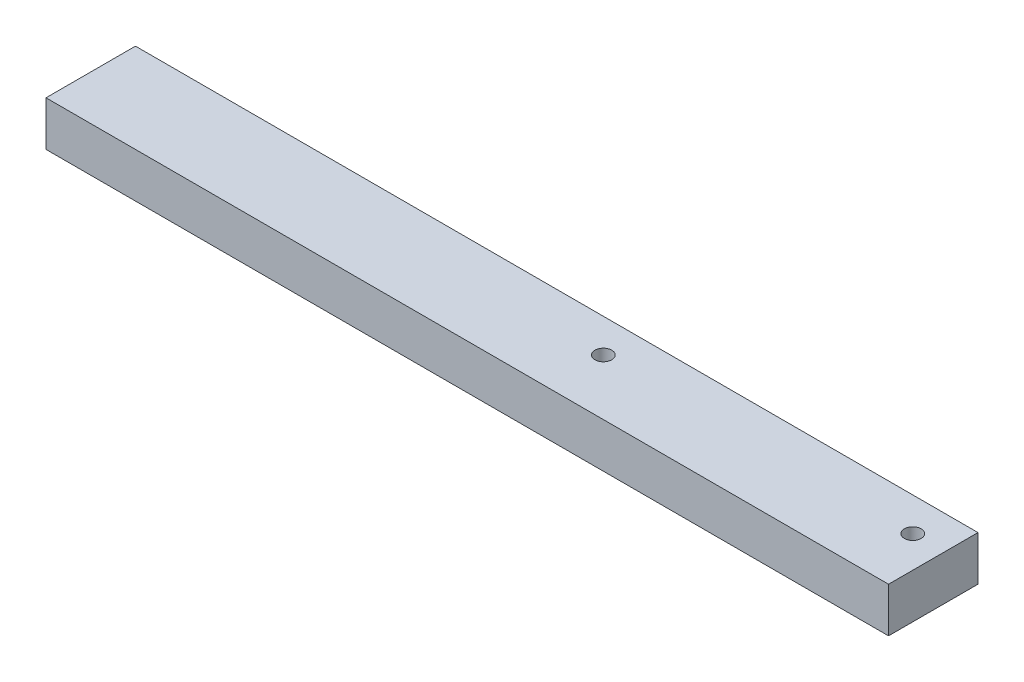
ISO-10303-21;
HEADER;
FILE_DESCRIPTION(('STEP AP214'),'2;1');
FILE_NAME('part.step','',(''),(''),'','','');
FILE_SCHEMA(('AUTOMOTIVE_DESIGN { 1 0 10303 214 1 1 1 1 }'));
ENDSEC;
DATA;
#1=APPLICATION_CONTEXT('core data for automotive mechanical design processes');
#2=APPLICATION_PROTOCOL_DEFINITION('international standard','automotive_design',2000,#1);
#3=PRODUCT_CONTEXT('',#1,'mechanical');
#4=PRODUCT('Part','Part','',(#3));
#5=PRODUCT_RELATED_PRODUCT_CATEGORY('part','',(#4));
#6=PRODUCT_DEFINITION_FORMATION('','',#4);
#7=PRODUCT_DEFINITION_CONTEXT('part definition',#1,'design');
#8=PRODUCT_DEFINITION('design','',#6,#7);
#9=PRODUCT_DEFINITION_SHAPE('','',#8);
#10=(LENGTH_UNIT() NAMED_UNIT(*) SI_UNIT(.MILLI.,.METRE.));
#11=(NAMED_UNIT(*) PLANE_ANGLE_UNIT() SI_UNIT($,.RADIAN.));
#12=(NAMED_UNIT(*) SI_UNIT($,.STERADIAN.) SOLID_ANGLE_UNIT());
#13=UNCERTAINTY_MEASURE_WITH_UNIT(LENGTH_MEASURE(1.E-05),#10,'distance_accuracy_value','');
#14=(GEOMETRIC_REPRESENTATION_CONTEXT(3) GLOBAL_UNCERTAINTY_ASSIGNED_CONTEXT((#13)) GLOBAL_UNIT_ASSIGNED_CONTEXT((#10,
#11,#12)) REPRESENTATION_CONTEXT('',''));
#15=CARTESIAN_POINT('',(0.,0.,0.));
#16=DIRECTION('',(0.,0.,1.));
#17=DIRECTION('',(1.,0.,0.));
#18=AXIS2_PLACEMENT_3D('',#15,#16,#17);
#19=CARTESIAN_POINT('',(226.,23.9999999999995,24.0000000000001));
#20=DIRECTION('',(-1.,0.,0.));
#21=DIRECTION('',(0.,0.,1.));
#22=AXIS2_PLACEMENT_3D('',#19,#20,#21);
#23=PLANE('',#22);
#24=DIRECTION('',(0.,0.,-1.));
#25=VECTOR('',#24,1.);
#26=CARTESIAN_POINT('',(226.,-5.55111512312578E-13,24.));
#27=LINE('',#26,#25);
#28=CARTESIAN_POINT('',(226.,-5.55111512312578E-13,24.));
#29=VERTEX_POINT('',#28);
#30=CARTESIAN_POINT('',(226.,7.49400541621981E-13,-24.));
#31=VERTEX_POINT('',#30);
#32=EDGE_CURVE('E114',#29,#31,#27,.T.);
#33=ORIENTED_EDGE('',*,*,#32,.T.);
#34=DIRECTION('',(0.,-1.,0.));
#35=VECTOR('',#34,1.);
#36=CARTESIAN_POINT('',(226.,24.,-24.));
#37=LINE('',#36,#35);
#38=CARTESIAN_POINT('',(226.,24.,-24.));
#39=VERTEX_POINT('',#38);
#40=EDGE_CURVE('E11',#39,#31,#37,.T.);
#41=ORIENTED_EDGE('',*,*,#40,.F.);
#42=DIRECTION('',(0.,0.,-1.));
#43=VECTOR('',#42,1.);
#44=CARTESIAN_POINT('',(226.,23.9999999999995,24.0000000000001));
#45=LINE('',#44,#43);
#46=CARTESIAN_POINT('',(226.,23.9999999999995,24.0000000000001));
#47=VERTEX_POINT('',#46);
#48=EDGE_CURVE('E97',#47,#39,#45,.T.);
#49=ORIENTED_EDGE('',*,*,#48,.F.);
#50=DIRECTION('',(0.,-1.,0.));
#51=VECTOR('',#50,1.);
#52=CARTESIAN_POINT('',(226.,23.9999999999995,24.0000000000001));
#53=LINE('',#52,#51);
#54=EDGE_CURVE('E110',#47,#29,#53,.T.);
#55=ORIENTED_EDGE('',*,*,#54,.T.);
#56=EDGE_LOOP('',(#33,#41,#49,#55));
#57=FACE_BOUND('',#56,.T.);
#58=ADVANCED_FACE('F45',(#57),#23,.F.);
#59=CARTESIAN_POINT('',(-226.,24.0000000000007,-24.));
#60=DIRECTION('',(0.,0.,1.));
#61=DIRECTION('',(1.,0.,0.));
#62=AXIS2_PLACEMENT_3D('',#59,#60,#61);
#63=PLANE('',#62);
#64=DIRECTION('',(-1.,0.,0.));
#65=VECTOR('',#64,1.);
#66=CARTESIAN_POINT('',(-226.,7.49400541621981E-13,-24.));
#67=LINE('',#66,#65);
#68=CARTESIAN_POINT('',(-226.,7.49400541621981E-13,-24.));
#69=VERTEX_POINT('',#68);
#70=EDGE_CURVE('E102',#31,#69,#67,.T.);
#71=ORIENTED_EDGE('',*,*,#70,.T.);
#72=DIRECTION('',(0.,-1.,0.));
#73=VECTOR('',#72,1.);
#74=CARTESIAN_POINT('',(-226.,24.0000000000007,-24.));
#75=LINE('',#74,#73);
#76=CARTESIAN_POINT('',(-226.,24.0000000000007,-24.));
#77=VERTEX_POINT('',#76);
#78=EDGE_CURVE('E54',#77,#69,#75,.T.);
#79=ORIENTED_EDGE('',*,*,#78,.F.);
#80=DIRECTION('',(-1.,0.,0.));
#81=VECTOR('',#80,1.);
#82=CARTESIAN_POINT('',(-226.,24.0000000000007,-24.));
#83=LINE('',#82,#81);
#84=EDGE_CURVE('E92',#39,#77,#83,.T.);
#85=ORIENTED_EDGE('',*,*,#84,.F.);
#86=ORIENTED_EDGE('',*,*,#40,.T.);
#87=EDGE_LOOP('',(#71,#79,#85,#86));
#88=FACE_BOUND('',#87,.T.);
#89=ADVANCED_FACE('F101',(#88),#63,.F.);
#90=CARTESIAN_POINT('',(-226.,24.,24.0000000000001));
#91=DIRECTION('',(1.,0.,0.));
#92=DIRECTION('',(0.,0.,-1.));
#93=AXIS2_PLACEMENT_3D('',#90,#91,#92);
#94=PLANE('',#93);
#95=DIRECTION('',(0.,0.,1.));
#96=VECTOR('',#95,1.);
#97=CARTESIAN_POINT('',(-226.,-5.55111512312578E-13,24.));
#98=LINE('',#97,#96);
#99=CARTESIAN_POINT('',(-226.,-5.55111512312578E-13,24.));
#100=VERTEX_POINT('',#99);
#101=EDGE_CURVE('E79',#69,#100,#98,.T.);
#102=ORIENTED_EDGE('',*,*,#101,.T.);
#103=DIRECTION('',(0.,-1.,0.));
#104=VECTOR('',#103,1.);
#105=CARTESIAN_POINT('',(-226.,24.,24.0000000000001));
#106=LINE('',#105,#104);
#107=CARTESIAN_POINT('',(-226.,24.,24.0000000000001));
#108=VERTEX_POINT('',#107);
#109=EDGE_CURVE('E104',#108,#100,#106,.T.);
#110=ORIENTED_EDGE('',*,*,#109,.F.);
#111=DIRECTION('',(0.,0.,1.));
#112=VECTOR('',#111,1.);
#113=CARTESIAN_POINT('',(-226.,24.,24.0000000000001));
#114=LINE('',#113,#112);
#115=EDGE_CURVE('E95',#77,#108,#114,.T.);
#116=ORIENTED_EDGE('',*,*,#115,.F.);
#117=ORIENTED_EDGE('',*,*,#78,.T.);
#118=EDGE_LOOP('',(#102,#110,#116,#117));
#119=FACE_BOUND('',#118,.T.);
#120=ADVANCED_FACE('F105',(#119),#94,.F.);
#121=CARTESIAN_POINT('',(-226.,24.,24.0000000000001));
#122=DIRECTION('',(0.,0.,-1.));
#123=DIRECTION('',(-1.,0.,0.));
#124=AXIS2_PLACEMENT_3D('',#121,#122,#123);
#125=PLANE('',#124);
#126=DIRECTION('',(1.,0.,0.));
#127=VECTOR('',#126,1.);
#128=CARTESIAN_POINT('',(-226.,-5.55111512312578E-13,24.));
#129=LINE('',#128,#127);
#130=EDGE_CURVE('E85',#100,#29,#129,.T.);
#131=ORIENTED_EDGE('',*,*,#130,.T.);
#132=ORIENTED_EDGE('',*,*,#54,.F.);
#133=DIRECTION('',(1.,0.,0.));
#134=VECTOR('',#133,1.);
#135=CARTESIAN_POINT('',(-226.,24.,24.0000000000001));
#136=LINE('',#135,#134);
#137=EDGE_CURVE('E62',#108,#47,#136,.T.);
#138=ORIENTED_EDGE('',*,*,#137,.F.);
#139=ORIENTED_EDGE('',*,*,#109,.T.);
#140=EDGE_LOOP('',(#131,#132,#138,#139));
#141=FACE_BOUND('',#140,.T.);
#142=ADVANCED_FACE('F129',(#141),#125,.F.);
#143=CARTESIAN_POINT('',(0.,24.,0.));
#144=DIRECTION('',(0.,-1.,0.));
#145=DIRECTION('',(0.,0.,-1.));
#146=AXIS2_PLACEMENT_3D('',#143,#144,#145);
#147=PLANE('',#146);
#148=CARTESIAN_POINT('',(209.,24.,-5.99999999999995));
#149=DIRECTION('',(0.,-1.,0.));
#150=DIRECTION('',(0.,0.,-1.));
#151=AXIS2_PLACEMENT_3D('',#148,#149,#150);
#152=CIRCLE('',#151,4.49999999999999);
#153=CARTESIAN_POINT('',(209.,24.,-10.4999999999999));
#154=VERTEX_POINT('',#153);
#155=EDGE_CURVE('E118',#154,#154,#152,.T.);
#156=ORIENTED_EDGE('',*,*,#155,.T.);
#157=EDGE_LOOP('',(#156));
#158=FACE_BOUND('',#157,.T.);
#159=CARTESIAN_POINT('',(43.,24.,-5.99999999999995));
#160=DIRECTION('',(0.,-1.,0.));
#161=DIRECTION('',(0.,0.,-1.));
#162=AXIS2_PLACEMENT_3D('',#159,#160,#161);
#163=CIRCLE('',#162,4.5);
#164=CARTESIAN_POINT('',(43.,24.,-10.4999999999999));
#165=VERTEX_POINT('',#164);
#166=EDGE_CURVE('E137',#165,#165,#163,.T.);
#167=ORIENTED_EDGE('',*,*,#166,.T.);
#168=EDGE_LOOP('',(#167));
#169=FACE_BOUND('',#168,.T.);
#170=ORIENTED_EDGE('',*,*,#48,.T.);
#171=ORIENTED_EDGE('',*,*,#84,.T.);
#172=ORIENTED_EDGE('',*,*,#115,.T.);
#173=ORIENTED_EDGE('',*,*,#137,.T.);
#174=EDGE_LOOP('',(#170,#171,#172,#173));
#175=FACE_BOUND('',#174,.T.);
#176=ADVANCED_FACE('F93',(#158,#169,#175),#147,.F.);
#177=CARTESIAN_POINT('',(0.,0.,0.));
#178=DIRECTION('',(0.,-1.,0.));
#179=DIRECTION('',(0.,0.,-1.));
#180=AXIS2_PLACEMENT_3D('',#177,#178,#179);
#181=PLANE('',#180);
#182=CARTESIAN_POINT('',(209.,0.,-6.00000000000001));
#183=DIRECTION('',(0.,-1.,0.));
#184=DIRECTION('',(0.,0.,-1.));
#185=AXIS2_PLACEMENT_3D('',#182,#183,#184);
#186=CIRCLE('',#185,4.49999999999999);
#187=CARTESIAN_POINT('',(209.,0.,-10.5));
#188=VERTEX_POINT('',#187);
#189=EDGE_CURVE('E145',#188,#188,#186,.T.);
#190=ORIENTED_EDGE('',*,*,#189,.F.);
#191=EDGE_LOOP('',(#190));
#192=FACE_BOUND('',#191,.T.);
#193=CARTESIAN_POINT('',(43.,0.,-6.00000000000001));
#194=DIRECTION('',(0.,-1.,0.));
#195=DIRECTION('',(0.,0.,-1.));
#196=AXIS2_PLACEMENT_3D('',#193,#194,#195);
#197=CIRCLE('',#196,4.5);
#198=CARTESIAN_POINT('',(43.,0.,-10.5));
#199=VERTEX_POINT('',#198);
#200=EDGE_CURVE('E141',#199,#199,#197,.T.);
#201=ORIENTED_EDGE('',*,*,#200,.F.);
#202=EDGE_LOOP('',(#201));
#203=FACE_BOUND('',#202,.T.);
#204=ORIENTED_EDGE('',*,*,#32,.F.);
#205=ORIENTED_EDGE('',*,*,#130,.F.);
#206=ORIENTED_EDGE('',*,*,#101,.F.);
#207=ORIENTED_EDGE('',*,*,#70,.F.);
#208=EDGE_LOOP('',(#204,#205,#206,#207));
#209=FACE_BOUND('',#208,.T.);
#210=ADVANCED_FACE('F132',(#192,#203,#209),#181,.T.);
#211=CARTESIAN_POINT('',(43.,24.,-5.99999999999995));
#212=DIRECTION('',(0.,-1.,0.));
#213=DIRECTION('',(0.,0.,-1.));
#214=AXIS2_PLACEMENT_3D('',#211,#212,#213);
#215=CYLINDRICAL_SURFACE('',#214,4.5);
#216=ORIENTED_EDGE('',*,*,#166,.F.);
#217=EDGE_LOOP('',(#216));
#218=FACE_BOUND('',#217,.T.);
#219=ORIENTED_EDGE('',*,*,#200,.T.);
#220=EDGE_LOOP('',(#219));
#221=FACE_BOUND('',#220,.T.);
#222=ADVANCED_FACE('F159',(#218,#221),#215,.F.);
#223=CARTESIAN_POINT('',(209.,24.,-5.99999999999995));
#224=DIRECTION('',(0.,-1.,0.));
#225=DIRECTION('',(0.,0.,-1.));
#226=AXIS2_PLACEMENT_3D('',#223,#224,#225);
#227=CYLINDRICAL_SURFACE('',#226,4.49999999999999);
#228=ORIENTED_EDGE('',*,*,#155,.F.);
#229=EDGE_LOOP('',(#228));
#230=FACE_BOUND('',#229,.T.);
#231=ORIENTED_EDGE('',*,*,#189,.T.);
#232=EDGE_LOOP('',(#231));
#233=FACE_BOUND('',#232,.T.);
#234=ADVANCED_FACE('F156',(#230,#233),#227,.F.);
#235=CLOSED_SHELL('',(#58,#89,#120,#142,#176,#210,#222,#234));
#236=MANIFOLD_SOLID_BREP('B2',#235);
#237=ADVANCED_BREP_SHAPE_REPRESENTATION('',(#18,#236),#14);
#238=SHAPE_DEFINITION_REPRESENTATION(#9,#237);
ENDSEC;
END-ISO-10303-21;
